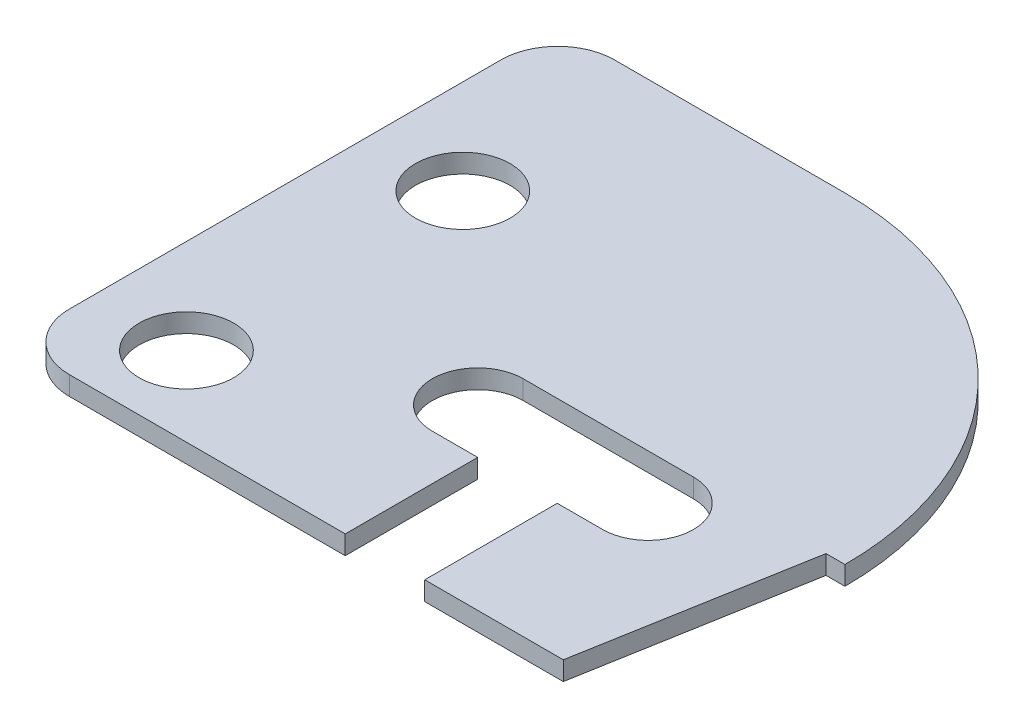
ISO-10303-21;
HEADER;
FILE_DESCRIPTION(('STEP AP214'),'2;1');
FILE_NAME('part.step','',(''),(''),'','','');
FILE_SCHEMA(('AUTOMOTIVE_DESIGN { 1 0 10303 214 1 1 1 1 }'));
ENDSEC;
DATA;
#1=APPLICATION_CONTEXT('core data for automotive mechanical design processes');
#2=APPLICATION_PROTOCOL_DEFINITION('international standard','automotive_design',2000,#1);
#3=PRODUCT_CONTEXT('',#1,'mechanical');
#4=PRODUCT('Part','Part','',(#3));
#5=PRODUCT_RELATED_PRODUCT_CATEGORY('part','',(#4));
#6=PRODUCT_DEFINITION_FORMATION('','',#4);
#7=PRODUCT_DEFINITION_CONTEXT('part definition',#1,'design');
#8=PRODUCT_DEFINITION('design','',#6,#7);
#9=PRODUCT_DEFINITION_SHAPE('','',#8);
#10=(LENGTH_UNIT() NAMED_UNIT(*) SI_UNIT(.MILLI.,.METRE.));
#11=(NAMED_UNIT(*) PLANE_ANGLE_UNIT() SI_UNIT($,.RADIAN.));
#12=(NAMED_UNIT(*) SI_UNIT($,.STERADIAN.) SOLID_ANGLE_UNIT());
#13=UNCERTAINTY_MEASURE_WITH_UNIT(LENGTH_MEASURE(1.E-05),#10,'distance_accuracy_value','');
#14=(GEOMETRIC_REPRESENTATION_CONTEXT(3) GLOBAL_UNCERTAINTY_ASSIGNED_CONTEXT((#13)) GLOBAL_UNIT_ASSIGNED_CONTEXT((#10,
#11,#12)) REPRESENTATION_CONTEXT('',''));
#15=CARTESIAN_POINT('',(0.,0.,0.));
#16=DIRECTION('',(0.,0.,1.));
#17=DIRECTION('',(1.,0.,0.));
#18=AXIS2_PLACEMENT_3D('',#15,#16,#17);
#19=CARTESIAN_POINT('',(-30.87318549428,0.,-85.));
#20=DIRECTION('',(0.,0.,-1.));
#21=DIRECTION('',(0.984807753012209,0.173648177666927,0.));
#22=AXIS2_PLACEMENT_3D('',#19,#20,#21);
#23=PLANE('',#22);
#24=DIRECTION('',(1.,0.,0.));
#25=VECTOR('',#24,1.);
#26=CARTESIAN_POINT('',(-30.87318549428,0.,-85.));
#27=LINE('',#26,#25);
#28=CARTESIAN_POINT('',(-60.87318549428,1.73472347597681E-13,-85.));
#29=VERTEX_POINT('',#28);
#30=CARTESIAN_POINT('',(0.,0.,-85.));
#31=VERTEX_POINT('',#30);
#32=EDGE_CURVE('E275',#29,#31,#27,.T.);
#33=ORIENTED_EDGE('',*,*,#32,.T.);
#34=DIRECTION('',(0.,1.,0.));
#35=VECTOR('',#34,1.);
#36=CARTESIAN_POINT('',(0.,-5.,-85.));
#37=LINE('',#36,#35);
#38=CARTESIAN_POINT('',(0.,-5.,-85.));
#39=VERTEX_POINT('',#38);
#40=EDGE_CURVE('E228',#39,#31,#37,.T.);
#41=ORIENTED_EDGE('',*,*,#40,.F.);
#42=DIRECTION('',(-1.,0.,0.));
#43=VECTOR('',#42,1.);
#44=CARTESIAN_POINT('',(-60.87318549428,-4.99999999999983,-85.));
#45=LINE('',#44,#43);
#46=CARTESIAN_POINT('',(-60.87318549428,-4.99999999999983,-85.));
#47=VERTEX_POINT('',#46);
#48=EDGE_CURVE('E285',#47,#39,#45,.F.);
#49=ORIENTED_EDGE('',*,*,#48,.F.);
#50=DIRECTION('',(0.,-1.,0.));
#51=VECTOR('',#50,1.);
#52=CARTESIAN_POINT('',(-60.87318549428,1.73472347597681E-13,-85.));
#53=LINE('',#52,#51);
#54=EDGE_CURVE('E13',#29,#47,#53,.T.);
#55=ORIENTED_EDGE('',*,*,#54,.F.);
#56=EDGE_LOOP('',(#33,#41,#49,#55));
#57=FACE_BOUND('',#56,.T.);
#58=ADVANCED_FACE('F67',(#57),#23,.T.);
#59=CARTESIAN_POINT('',(-60.8731854942799,1.73472347597681E-13,59.));
#60=DIRECTION('',(0.,0.,1.));
#61=DIRECTION('',(0.173648177666927,-0.984807753012209,0.));
#62=AXIS2_PLACEMENT_3D('',#59,#60,#61);
#63=PLANE('',#62);
#64=DIRECTION('',(1.,0.,0.));
#65=VECTOR('',#64,1.);
#66=CARTESIAN_POINT('',(-60.87318549428,-4.99999999999983,59.));
#67=LINE('',#66,#65);
#68=CARTESIAN_POINT('',(12.,-5.,59.));
#69=VERTEX_POINT('',#68);
#70=CARTESIAN_POINT('',(-60.87318549428,-4.99999999999983,59.));
#71=VERTEX_POINT('',#70);
#72=EDGE_CURVE('E115',#69,#71,#67,.F.);
#73=ORIENTED_EDGE('',*,*,#72,.F.);
#74=DIRECTION('',(0.,1.,0.));
#75=VECTOR('',#74,1.);
#76=CARTESIAN_POINT('',(12.,-5.,59.));
#77=LINE('',#76,#75);
#78=CARTESIAN_POINT('',(12.,0.,59.));
#79=VERTEX_POINT('',#78);
#80=EDGE_CURVE('E266',#69,#79,#77,.T.);
#81=ORIENTED_EDGE('',*,*,#80,.T.);
#82=DIRECTION('',(-1.,0.,0.));
#83=VECTOR('',#82,1.);
#84=CARTESIAN_POINT('',(-60.8731854942799,1.73472347597681E-13,59.));
#85=LINE('',#84,#83);
#86=CARTESIAN_POINT('',(-60.8731854942799,1.73472347597681E-13,59.));
#87=VERTEX_POINT('',#86);
#88=EDGE_CURVE('E123',#79,#87,#85,.T.);
#89=ORIENTED_EDGE('',*,*,#88,.T.);
#90=DIRECTION('',(0.,-1.,0.));
#91=VECTOR('',#90,1.);
#92=CARTESIAN_POINT('',(-60.8731854942799,1.59594559789866E-13,59.));
#93=LINE('',#92,#91);
#94=EDGE_CURVE('E273',#87,#71,#93,.T.);
#95=ORIENTED_EDGE('',*,*,#94,.T.);
#96=EDGE_LOOP('',(#73,#81,#89,#95));
#97=FACE_BOUND('',#96,.T.);
#98=ADVANCED_FACE('F315',(#97),#63,.T.);
#99=CARTESIAN_POINT('',(0.,0.,12.));
#100=DIRECTION('',(0.,1.,0.));
#101=DIRECTION('',(0.,0.,1.));
#102=AXIS2_PLACEMENT_3D('',#99,#100,#101);
#103=PLANE('',#102);
#104=CARTESIAN_POINT('',(-50.9494325752403,1.11022302462516E-13,-35.));
#105=DIRECTION('',(0.,1.,0.));
#106=DIRECTION('',(-1.,0.,0.));
#107=AXIS2_PLACEMENT_3D('',#104,#105,#106);
#108=CIRCLE('',#107,12.5);
#109=CARTESIAN_POINT('',(-63.4494325752403,1.98105420956551E-13,-35.));
#110=VERTEX_POINT('',#109);
#111=EDGE_CURVE('E263',#110,#110,#108,.T.);
#112=ORIENTED_EDGE('',*,*,#111,.F.);
#113=EDGE_LOOP('',(#112));
#114=FACE_BOUND('',#113,.T.);
#115=CARTESIAN_POINT('',(-50.9494325752403,1.11022302462516E-13,38.));
#116=DIRECTION('',(0.,1.,0.));
#117=DIRECTION('',(-1.,0.,0.));
#118=AXIS2_PLACEMENT_3D('',#115,#116,#117);
#119=CIRCLE('',#118,12.5);
#120=CARTESIAN_POINT('',(-63.4494325752403,1.98105420956551E-13,38.));
#121=VERTEX_POINT('',#120);
#122=EDGE_CURVE('E267',#121,#121,#119,.T.);
#123=ORIENTED_EDGE('',*,*,#122,.F.);
#124=EDGE_LOOP('',(#123));
#125=FACE_BOUND('',#124,.T.);
#126=ORIENTED_EDGE('',*,*,#88,.F.);
#127=DIRECTION('',(0.,0.,-1.));
#128=VECTOR('',#127,1.);
#129=CARTESIAN_POINT('',(12.,0.,24.));
#130=LINE('',#129,#128);
#131=CARTESIAN_POINT('',(12.,0.,24.));
#132=VERTEX_POINT('',#131);
#133=EDGE_CURVE('E385',#79,#132,#130,.T.);
#134=ORIENTED_EDGE('',*,*,#133,.T.);
#135=DIRECTION('',(-1.,0.,0.));
#136=VECTOR('',#135,1.);
#137=CARTESIAN_POINT('',(0.,0.,24.));
#138=LINE('',#137,#136);
#139=CARTESIAN_POINT('',(0.,0.,24.));
#140=VERTEX_POINT('',#139);
#141=EDGE_CURVE('E387',#132,#140,#138,.T.);
#142=ORIENTED_EDGE('',*,*,#141,.T.);
#143=CARTESIAN_POINT('',(0.,0.,12.));
#144=DIRECTION('',(0.,-1.,0.));
#145=DIRECTION('',(0.,0.,1.));
#146=AXIS2_PLACEMENT_3D('',#143,#144,#145);
#147=CIRCLE('',#146,12.);
#148=CARTESIAN_POINT('',(0.,0.,0.));
#149=VERTEX_POINT('',#148);
#150=EDGE_CURVE('E203',#140,#149,#147,.T.);
#151=ORIENTED_EDGE('',*,*,#150,.T.);
#152=DIRECTION('',(1.,0.,0.));
#153=VECTOR('',#152,1.);
#154=CARTESIAN_POINT('',(0.,0.,0.));
#155=LINE('',#154,#153);
#156=CARTESIAN_POINT('',(45.,0.,0.));
#157=VERTEX_POINT('',#156);
#158=EDGE_CURVE('E198',#149,#157,#155,.T.);
#159=ORIENTED_EDGE('',*,*,#158,.T.);
#160=CARTESIAN_POINT('',(45.,0.,12.));
#161=DIRECTION('',(0.,-1.,0.));
#162=DIRECTION('',(0.,0.,1.));
#163=AXIS2_PLACEMENT_3D('',#160,#161,#162);
#164=CIRCLE('',#163,12.);
#165=CARTESIAN_POINT('',(45.,0.,24.));
#166=VERTEX_POINT('',#165);
#167=EDGE_CURVE('E373',#157,#166,#164,.T.);
#168=ORIENTED_EDGE('',*,*,#167,.T.);
#169=DIRECTION('',(-1.,0.,0.));
#170=VECTOR('',#169,1.);
#171=CARTESIAN_POINT('',(33.,0.,24.));
#172=LINE('',#171,#170);
#173=CARTESIAN_POINT('',(33.,0.,24.));
#174=VERTEX_POINT('',#173);
#175=EDGE_CURVE('E369',#166,#174,#172,.T.);
#176=ORIENTED_EDGE('',*,*,#175,.T.);
#177=DIRECTION('',(0.,0.,1.));
#178=VECTOR('',#177,1.);
#179=CARTESIAN_POINT('',(33.,0.,24.));
#180=LINE('',#179,#178);
#181=CARTESIAN_POINT('',(33.,0.,59.));
#182=VERTEX_POINT('',#181);
#183=EDGE_CURVE('E364',#174,#182,#180,.T.);
#184=ORIENTED_EDGE('',*,*,#183,.T.);
#185=DIRECTION('',(1.,0.,0.));
#186=VECTOR('',#185,1.);
#187=CARTESIAN_POINT('',(33.,0.,59.));
#188=LINE('',#187,#186);
#189=CARTESIAN_POINT('',(69.5967081382004,0.,59.));
#190=VERTEX_POINT('',#189);
#191=EDGE_CURVE('E359',#182,#190,#188,.T.);
#192=ORIENTED_EDGE('',*,*,#191,.T.);
#193=DIRECTION('',(0.173648177666934,0.,-0.984807753012208));
#194=VECTOR('',#193,1.);
#195=CARTESIAN_POINT('',(80.,0.,0.));
#196=LINE('',#195,#194);
#197=CARTESIAN_POINT('',(80.,0.,0.));
#198=VERTEX_POINT('',#197);
#199=EDGE_CURVE('E352',#190,#198,#196,.T.);
#200=ORIENTED_EDGE('',*,*,#199,.T.);
#201=DIRECTION('',(1.,0.,0.));
#202=VECTOR('',#201,1.);
#203=CARTESIAN_POINT('',(85.,0.,0.));
#204=LINE('',#203,#202);
#205=CARTESIAN_POINT('',(85.,0.,0.));
#206=VERTEX_POINT('',#205);
#207=EDGE_CURVE('E347',#198,#206,#204,.T.);
#208=ORIENTED_EDGE('',*,*,#207,.T.);
#209=CARTESIAN_POINT('',(0.,0.,0.));
#210=DIRECTION('',(0.,1.,0.));
#211=DIRECTION('',(0.,0.,-1.));
#212=AXIS2_PLACEMENT_3D('',#209,#210,#211);
#213=CIRCLE('',#212,85.);
#214=EDGE_CURVE('E383',#206,#31,#213,.T.);
#215=ORIENTED_EDGE('',*,*,#214,.T.);
#216=ORIENTED_EDGE('',*,*,#32,.F.);
#217=CARTESIAN_POINT('',(-60.87318549428,1.73472347597681E-13,-70.));
#218=DIRECTION('',(0.,1.,0.));
#219=DIRECTION('',(-1.,0.,0.));
#220=AXIS2_PLACEMENT_3D('',#217,#218,#219);
#221=CIRCLE('',#220,15.);
#222=CARTESIAN_POINT('',(-75.87318549428,2.77555756156289E-13,-70.));
#223=VERTEX_POINT('',#222);
#224=EDGE_CURVE('E277',#223,#29,#221,.F.);
#225=ORIENTED_EDGE('',*,*,#224,.F.);
#226=DIRECTION('',(0.,0.,-1.));
#227=VECTOR('',#226,1.);
#228=CARTESIAN_POINT('',(-75.87318549428,2.77555756156289E-13,-70.));
#229=LINE('',#228,#227);
#230=CARTESIAN_POINT('',(-75.87318549428,2.77555756156289E-13,44.));
#231=VERTEX_POINT('',#230);
#232=EDGE_CURVE('E279',#231,#223,#229,.T.);
#233=ORIENTED_EDGE('',*,*,#232,.F.);
#234=CARTESIAN_POINT('',(-60.8731854942799,1.73472347597681E-13,44.));
#235=DIRECTION('',(0.,1.,0.));
#236=DIRECTION('',(-1.,0.,0.));
#237=AXIS2_PLACEMENT_3D('',#234,#235,#236);
#238=CIRCLE('',#237,15.);
#239=EDGE_CURVE('E282',#87,#231,#238,.F.);
#240=ORIENTED_EDGE('',*,*,#239,.F.);
#241=EDGE_LOOP('',(#126,#134,#142,#151,#159,#168,#176,#184,#192,#200,#208,#215,#216,#225,#233,#240));
#242=FACE_BOUND('',#241,.T.);
#243=ADVANCED_FACE('F69',(#114,#125,#242),#103,.T.);
#244=CARTESIAN_POINT('',(-60.87318549428,-4.99999999999983,-70.));
#245=DIRECTION('',(0.,1.,0.));
#246=DIRECTION('',(-1.,0.,0.));
#247=AXIS2_PLACEMENT_3D('',#244,#245,#246);
#248=PLANE('',#247);
#249=CARTESIAN_POINT('',(-50.9494325752404,-4.99999999999991,-35.));
#250=DIRECTION('',(0.,1.,0.));
#251=DIRECTION('',(-1.,0.,0.));
#252=AXIS2_PLACEMENT_3D('',#249,#250,#251);
#253=CIRCLE('',#252,12.5);
#254=CARTESIAN_POINT('',(-63.4494325752404,-4.99999999999983,-35.));
#255=VERTEX_POINT('',#254);
#256=EDGE_CURVE('E71',#255,#255,#253,.T.);
#257=ORIENTED_EDGE('',*,*,#256,.T.);
#258=EDGE_LOOP('',(#257));
#259=FACE_BOUND('',#258,.T.);
#260=CARTESIAN_POINT('',(-50.9494325752403,-4.99999999999993,38.));
#261=DIRECTION('',(0.,1.,0.));
#262=DIRECTION('',(-1.,0.,0.));
#263=AXIS2_PLACEMENT_3D('',#260,#261,#262);
#264=CIRCLE('',#263,12.5);
#265=CARTESIAN_POINT('',(-63.4494325752403,-4.99999999999984,38.));
#266=VERTEX_POINT('',#265);
#267=EDGE_CURVE('E269',#266,#266,#264,.T.);
#268=ORIENTED_EDGE('',*,*,#267,.T.);
#269=EDGE_LOOP('',(#268));
#270=FACE_BOUND('',#269,.T.);
#271=ORIENTED_EDGE('',*,*,#48,.T.);
#272=CARTESIAN_POINT('',(0.,-5.,0.));
#273=DIRECTION('',(0.,1.,0.));
#274=DIRECTION('',(0.,0.,-1.));
#275=AXIS2_PLACEMENT_3D('',#272,#273,#274);
#276=CIRCLE('',#275,85.);
#277=CARTESIAN_POINT('',(85.,-5.,0.));
#278=VERTEX_POINT('',#277);
#279=EDGE_CURVE('E231',#278,#39,#276,.T.);
#280=ORIENTED_EDGE('',*,*,#279,.F.);
#281=DIRECTION('',(1.,0.,0.));
#282=VECTOR('',#281,1.);
#283=CARTESIAN_POINT('',(85.,-5.,0.));
#284=LINE('',#283,#282);
#285=CARTESIAN_POINT('',(80.,-5.,0.));
#286=VERTEX_POINT('',#285);
#287=EDGE_CURVE('E236',#286,#278,#284,.T.);
#288=ORIENTED_EDGE('',*,*,#287,.F.);
#289=DIRECTION('',(0.173648177666934,0.,-0.984807753012208));
#290=VECTOR('',#289,1.);
#291=CARTESIAN_POINT('',(80.,-5.,0.));
#292=LINE('',#291,#290);
#293=CARTESIAN_POINT('',(69.5967081382004,-5.,59.));
#294=VERTEX_POINT('',#293);
#295=EDGE_CURVE('E241',#294,#286,#292,.T.);
#296=ORIENTED_EDGE('',*,*,#295,.F.);
#297=DIRECTION('',(1.,0.,0.));
#298=VECTOR('',#297,1.);
#299=CARTESIAN_POINT('',(33.,-5.,59.));
#300=LINE('',#299,#298);
#301=CARTESIAN_POINT('',(33.,-5.,59.));
#302=VERTEX_POINT('',#301);
#303=EDGE_CURVE('E246',#302,#294,#300,.T.);
#304=ORIENTED_EDGE('',*,*,#303,.F.);
#305=DIRECTION('',(0.,0.,1.));
#306=VECTOR('',#305,1.);
#307=CARTESIAN_POINT('',(33.,-5.,24.));
#308=LINE('',#307,#306);
#309=CARTESIAN_POINT('',(33.,-5.,24.));
#310=VERTEX_POINT('',#309);
#311=EDGE_CURVE('E251',#310,#302,#308,.T.);
#312=ORIENTED_EDGE('',*,*,#311,.F.);
#313=DIRECTION('',(-1.,0.,0.));
#314=VECTOR('',#313,1.);
#315=CARTESIAN_POINT('',(33.,-5.,24.));
#316=LINE('',#315,#314);
#317=CARTESIAN_POINT('',(45.,-5.,24.));
#318=VERTEX_POINT('',#317);
#319=EDGE_CURVE('E256',#318,#310,#316,.T.);
#320=ORIENTED_EDGE('',*,*,#319,.F.);
#321=CARTESIAN_POINT('',(45.,-5.,12.));
#322=DIRECTION('',(0.,-1.,0.));
#323=DIRECTION('',(0.,0.,1.));
#324=AXIS2_PLACEMENT_3D('',#321,#322,#323);
#325=CIRCLE('',#324,12.);
#326=CARTESIAN_POINT('',(45.,-5.,0.));
#327=VERTEX_POINT('',#326);
#328=EDGE_CURVE('E213',#327,#318,#325,.T.);
#329=ORIENTED_EDGE('',*,*,#328,.F.);
#330=DIRECTION('',(1.,0.,0.));
#331=VECTOR('',#330,1.);
#332=CARTESIAN_POINT('',(0.,-5.,0.));
#333=LINE('',#332,#331);
#334=CARTESIAN_POINT('',(0.,-5.,0.));
#335=VERTEX_POINT('',#334);
#336=EDGE_CURVE('E196',#335,#327,#333,.T.);
#337=ORIENTED_EDGE('',*,*,#336,.F.);
#338=CARTESIAN_POINT('',(0.,-5.,12.));
#339=DIRECTION('',(0.,-1.,0.));
#340=DIRECTION('',(0.,0.,1.));
#341=AXIS2_PLACEMENT_3D('',#338,#339,#340);
#342=CIRCLE('',#341,12.);
#343=CARTESIAN_POINT('',(0.,-5.,24.));
#344=VERTEX_POINT('',#343);
#345=EDGE_CURVE('E204',#344,#335,#342,.T.);
#346=ORIENTED_EDGE('',*,*,#345,.F.);
#347=DIRECTION('',(-1.,0.,0.));
#348=VECTOR('',#347,1.);
#349=CARTESIAN_POINT('',(0.,-5.,24.));
#350=LINE('',#349,#348);
#351=CARTESIAN_POINT('',(12.,-5.,24.));
#352=VERTEX_POINT('',#351);
#353=EDGE_CURVE('E218',#352,#344,#350,.T.);
#354=ORIENTED_EDGE('',*,*,#353,.F.);
#355=DIRECTION('',(0.,0.,-1.));
#356=VECTOR('',#355,1.);
#357=CARTESIAN_POINT('',(12.,-5.,24.));
#358=LINE('',#357,#356);
#359=EDGE_CURVE('E225',#69,#352,#358,.T.);
#360=ORIENTED_EDGE('',*,*,#359,.F.);
#361=ORIENTED_EDGE('',*,*,#72,.T.);
#362=CARTESIAN_POINT('',(-60.87318549428,-4.99999999999983,44.));
#363=DIRECTION('',(0.,1.,0.));
#364=DIRECTION('',(-1.,0.,0.));
#365=AXIS2_PLACEMENT_3D('',#362,#363,#364);
#366=CIRCLE('',#365,15.);
#367=CARTESIAN_POINT('',(-75.87318549428,-4.99999999999973,44.));
#368=VERTEX_POINT('',#367);
#369=EDGE_CURVE('E293',#71,#368,#366,.F.);
#370=ORIENTED_EDGE('',*,*,#369,.T.);
#371=DIRECTION('',(0.,0.,1.));
#372=VECTOR('',#371,1.);
#373=CARTESIAN_POINT('',(-75.87318549428,-4.99999999999973,-70.));
#374=LINE('',#373,#372);
#375=CARTESIAN_POINT('',(-75.87318549428,-4.99999999999973,-70.));
#376=VERTEX_POINT('',#375);
#377=EDGE_CURVE('E290',#368,#376,#374,.F.);
#378=ORIENTED_EDGE('',*,*,#377,.T.);
#379=CARTESIAN_POINT('',(-60.87318549428,-4.99999999999983,-70.));
#380=DIRECTION('',(0.,1.,0.));
#381=DIRECTION('',(-1.,0.,0.));
#382=AXIS2_PLACEMENT_3D('',#379,#380,#381);
#383=CIRCLE('',#382,15.);
#384=EDGE_CURVE('E287',#376,#47,#383,.F.);
#385=ORIENTED_EDGE('',*,*,#384,.T.);
#386=EDGE_LOOP('',(#271,#280,#288,#296,#304,#312,#320,#329,#337,#346,#354,#360,#361,#370,#378,#385));
#387=FACE_BOUND('',#386,.T.);
#388=ADVANCED_FACE('F208',(#259,#270,#387),#248,.F.);
#389=CARTESIAN_POINT('',(-60.87318549428,1.73472347597681E-13,-70.));
#390=DIRECTION('',(0.,-1.,0.));
#391=DIRECTION('',(1.,0.,0.));
#392=AXIS2_PLACEMENT_3D('',#389,#390,#391);
#393=CYLINDRICAL_SURFACE('',#392,15.);
#394=ORIENTED_EDGE('',*,*,#384,.F.);
#395=DIRECTION('',(0.,-1.,0.));
#396=VECTOR('',#395,1.);
#397=CARTESIAN_POINT('',(-75.87318549428,2.63677968348475E-13,-70.));
#398=LINE('',#397,#396);
#399=EDGE_CURVE('E77',#223,#376,#398,.T.);
#400=ORIENTED_EDGE('',*,*,#399,.F.);
#401=ORIENTED_EDGE('',*,*,#224,.T.);
#402=ORIENTED_EDGE('',*,*,#54,.T.);
#403=EDGE_LOOP('',(#394,#400,#401,#402));
#404=FACE_BOUND('',#403,.T.);
#405=ADVANCED_FACE('F322',(#404),#393,.T.);
#406=CARTESIAN_POINT('',(-75.87318549428,2.63677968348475E-13,-70.));
#407=DIRECTION('',(-1.,0.,0.));
#408=DIRECTION('',(0.,-1.,0.));
#409=AXIS2_PLACEMENT_3D('',#406,#407,#408);
#410=PLANE('',#409);
#411=ORIENTED_EDGE('',*,*,#377,.F.);
#412=DIRECTION('',(0.,-1.,0.));
#413=VECTOR('',#412,1.);
#414=CARTESIAN_POINT('',(-75.8731854942799,2.63677968348475E-13,44.));
#415=LINE('',#414,#413);
#416=EDGE_CURVE('E107',#231,#368,#415,.T.);
#417=ORIENTED_EDGE('',*,*,#416,.F.);
#418=ORIENTED_EDGE('',*,*,#232,.T.);
#419=ORIENTED_EDGE('',*,*,#399,.T.);
#420=EDGE_LOOP('',(#411,#417,#418,#419));
#421=FACE_BOUND('',#420,.T.);
#422=ADVANCED_FACE('F311',(#421),#410,.T.);
#423=CARTESIAN_POINT('',(-60.8731854942799,1.73472347597681E-13,44.));
#424=DIRECTION('',(0.,-1.,0.));
#425=DIRECTION('',(1.,0.,0.));
#426=AXIS2_PLACEMENT_3D('',#423,#424,#425);
#427=CYLINDRICAL_SURFACE('',#426,15.);
#428=ORIENTED_EDGE('',*,*,#369,.F.);
#429=ORIENTED_EDGE('',*,*,#94,.F.);
#430=ORIENTED_EDGE('',*,*,#239,.T.);
#431=ORIENTED_EDGE('',*,*,#416,.T.);
#432=EDGE_LOOP('',(#428,#429,#430,#431));
#433=FACE_BOUND('',#432,.T.);
#434=ADVANCED_FACE('F302',(#433),#427,.T.);
#435=CARTESIAN_POINT('',(-50.9494325752412,-124.758900215609,38.));
#436=DIRECTION('',(0.,1.,0.));
#437=DIRECTION('',(-1.,0.,0.));
#438=AXIS2_PLACEMENT_3D('',#435,#436,#437);
#439=CYLINDRICAL_SURFACE('',#438,12.5);
#440=ORIENTED_EDGE('',*,*,#122,.T.);
#441=EDGE_LOOP('',(#440));
#442=FACE_BOUND('',#441,.T.);
#443=ORIENTED_EDGE('',*,*,#267,.F.);
#444=EDGE_LOOP('',(#443));
#445=FACE_BOUND('',#444,.T.);
#446=ADVANCED_FACE('F299',(#442,#445),#439,.F.);
#447=CARTESIAN_POINT('',(-50.9494325752412,-124.758900215609,-35.));
#448=DIRECTION('',(0.,1.,0.));
#449=DIRECTION('',(-1.,0.,0.));
#450=AXIS2_PLACEMENT_3D('',#447,#448,#449);
#451=CYLINDRICAL_SURFACE('',#450,12.5);
#452=ORIENTED_EDGE('',*,*,#111,.T.);
#453=EDGE_LOOP('',(#452));
#454=FACE_BOUND('',#453,.T.);
#455=ORIENTED_EDGE('',*,*,#256,.F.);
#456=EDGE_LOOP('',(#455));
#457=FACE_BOUND('',#456,.T.);
#458=ADVANCED_FACE('F301',(#454,#457),#451,.F.);
#459=CARTESIAN_POINT('',(0.,-5.,0.));
#460=DIRECTION('',(0.,0.,1.));
#461=DIRECTION('',(1.,0.,0.));
#462=AXIS2_PLACEMENT_3D('',#459,#460,#461);
#463=PLANE('',#462);
#464=ORIENTED_EDGE('',*,*,#158,.F.);
#465=DIRECTION('',(0.,1.,0.));
#466=VECTOR('',#465,1.);
#467=CARTESIAN_POINT('',(0.,-5.,0.));
#468=LINE('',#467,#466);
#469=EDGE_CURVE('E193',#335,#149,#468,.T.);
#470=ORIENTED_EDGE('',*,*,#469,.F.);
#471=ORIENTED_EDGE('',*,*,#336,.T.);
#472=DIRECTION('',(0.,1.,0.));
#473=VECTOR('',#472,1.);
#474=CARTESIAN_POINT('',(45.,-5.,0.));
#475=LINE('',#474,#473);
#476=EDGE_CURVE('E190',#327,#157,#475,.T.);
#477=ORIENTED_EDGE('',*,*,#476,.T.);
#478=EDGE_LOOP('',(#464,#470,#471,#477));
#479=FACE_BOUND('',#478,.T.);
#480=ADVANCED_FACE('F195',(#479),#463,.T.);
#481=CARTESIAN_POINT('',(45.,-5.,12.));
#482=DIRECTION('',(0.,1.,0.));
#483=DIRECTION('',(0.,0.,1.));
#484=AXIS2_PLACEMENT_3D('',#481,#482,#483);
#485=CYLINDRICAL_SURFACE('',#484,12.);
#486=ORIENTED_EDGE('',*,*,#167,.F.);
#487=ORIENTED_EDGE('',*,*,#476,.F.);
#488=ORIENTED_EDGE('',*,*,#328,.T.);
#489=DIRECTION('',(0.,1.,0.));
#490=VECTOR('',#489,1.);
#491=CARTESIAN_POINT('',(45.,-5.,24.));
#492=LINE('',#491,#490);
#493=EDGE_CURVE('E259',#318,#166,#492,.T.);
#494=ORIENTED_EDGE('',*,*,#493,.T.);
#495=EDGE_LOOP('',(#486,#487,#488,#494));
#496=FACE_BOUND('',#495,.T.);
#497=ADVANCED_FACE('F372',(#496),#485,.F.);
#498=CARTESIAN_POINT('',(33.,-5.,24.));
#499=DIRECTION('',(0.,0.,-1.));
#500=DIRECTION('',(-1.,0.,0.));
#501=AXIS2_PLACEMENT_3D('',#498,#499,#500);
#502=PLANE('',#501);
#503=ORIENTED_EDGE('',*,*,#175,.F.);
#504=ORIENTED_EDGE('',*,*,#493,.F.);
#505=ORIENTED_EDGE('',*,*,#319,.T.);
#506=DIRECTION('',(0.,1.,0.));
#507=VECTOR('',#506,1.);
#508=CARTESIAN_POINT('',(33.,-5.,24.));
#509=LINE('',#508,#507);
#510=EDGE_CURVE('E254',#310,#174,#509,.T.);
#511=ORIENTED_EDGE('',*,*,#510,.T.);
#512=EDGE_LOOP('',(#503,#504,#505,#511));
#513=FACE_BOUND('',#512,.T.);
#514=ADVANCED_FACE('F368',(#513),#502,.T.);
#515=CARTESIAN_POINT('',(33.,-5.,24.));
#516=DIRECTION('',(-1.,0.,0.));
#517=DIRECTION('',(0.,0.,1.));
#518=AXIS2_PLACEMENT_3D('',#515,#516,#517);
#519=PLANE('',#518);
#520=ORIENTED_EDGE('',*,*,#183,.F.);
#521=ORIENTED_EDGE('',*,*,#510,.F.);
#522=ORIENTED_EDGE('',*,*,#311,.T.);
#523=DIRECTION('',(0.,1.,0.));
#524=VECTOR('',#523,1.);
#525=CARTESIAN_POINT('',(33.,-5.,59.));
#526=LINE('',#525,#524);
#527=EDGE_CURVE('E249',#302,#182,#526,.T.);
#528=ORIENTED_EDGE('',*,*,#527,.T.);
#529=EDGE_LOOP('',(#520,#521,#522,#528));
#530=FACE_BOUND('',#529,.T.);
#531=ADVANCED_FACE('F363',(#530),#519,.T.);
#532=CARTESIAN_POINT('',(33.,-5.,59.));
#533=DIRECTION('',(0.,0.,1.));
#534=DIRECTION('',(1.,0.,0.));
#535=AXIS2_PLACEMENT_3D('',#532,#533,#534);
#536=PLANE('',#535);
#537=ORIENTED_EDGE('',*,*,#191,.F.);
#538=ORIENTED_EDGE('',*,*,#527,.F.);
#539=ORIENTED_EDGE('',*,*,#303,.T.);
#540=DIRECTION('',(0.,1.,0.));
#541=VECTOR('',#540,1.);
#542=CARTESIAN_POINT('',(69.5967081382004,-5.,59.));
#543=LINE('',#542,#541);
#544=EDGE_CURVE('E244',#294,#190,#543,.T.);
#545=ORIENTED_EDGE('',*,*,#544,.T.);
#546=EDGE_LOOP('',(#537,#538,#539,#545));
#547=FACE_BOUND('',#546,.T.);
#548=ADVANCED_FACE('F358',(#547),#536,.T.);
#549=CARTESIAN_POINT('',(80.,-5.,0.));
#550=DIRECTION('',(0.984807753012208,0.,0.173648177666934));
#551=DIRECTION('',(0.173648177666934,0.,-0.984807753012208));
#552=AXIS2_PLACEMENT_3D('',#549,#550,#551);
#553=PLANE('',#552);
#554=ORIENTED_EDGE('',*,*,#199,.F.);
#555=ORIENTED_EDGE('',*,*,#544,.F.);
#556=ORIENTED_EDGE('',*,*,#295,.T.);
#557=DIRECTION('',(0.,1.,0.));
#558=VECTOR('',#557,1.);
#559=CARTESIAN_POINT('',(80.,-5.,0.));
#560=LINE('',#559,#558);
#561=EDGE_CURVE('E239',#286,#198,#560,.T.);
#562=ORIENTED_EDGE('',*,*,#561,.T.);
#563=EDGE_LOOP('',(#554,#555,#556,#562));
#564=FACE_BOUND('',#563,.T.);
#565=ADVANCED_FACE('F351',(#564),#553,.T.);
#566=CARTESIAN_POINT('',(85.,-5.,0.));
#567=DIRECTION('',(0.,0.,1.));
#568=DIRECTION('',(1.,0.,0.));
#569=AXIS2_PLACEMENT_3D('',#566,#567,#568);
#570=PLANE('',#569);
#571=ORIENTED_EDGE('',*,*,#207,.F.);
#572=ORIENTED_EDGE('',*,*,#561,.F.);
#573=ORIENTED_EDGE('',*,*,#287,.T.);
#574=DIRECTION('',(0.,1.,0.));
#575=VECTOR('',#574,1.);
#576=CARTESIAN_POINT('',(85.,-5.,0.));
#577=LINE('',#576,#575);
#578=EDGE_CURVE('E234',#278,#206,#577,.T.);
#579=ORIENTED_EDGE('',*,*,#578,.T.);
#580=EDGE_LOOP('',(#571,#572,#573,#579));
#581=FACE_BOUND('',#580,.T.);
#582=ADVANCED_FACE('F345',(#581),#570,.T.);
#583=CARTESIAN_POINT('',(0.,-5.,0.));
#584=DIRECTION('',(0.,1.,0.));
#585=DIRECTION('',(0.,0.,1.));
#586=AXIS2_PLACEMENT_3D('',#583,#584,#585);
#587=CYLINDRICAL_SURFACE('',#586,85.);
#588=ORIENTED_EDGE('',*,*,#214,.F.);
#589=ORIENTED_EDGE('',*,*,#578,.F.);
#590=ORIENTED_EDGE('',*,*,#279,.T.);
#591=ORIENTED_EDGE('',*,*,#40,.T.);
#592=EDGE_LOOP('',(#588,#589,#590,#591));
#593=FACE_BOUND('',#592,.T.);
#594=ADVANCED_FACE('F340',(#593),#587,.T.);
#595=CARTESIAN_POINT('',(12.,-5.,24.));
#596=DIRECTION('',(1.,0.,0.));
#597=DIRECTION('',(0.,0.,-1.));
#598=AXIS2_PLACEMENT_3D('',#595,#596,#597);
#599=PLANE('',#598);
#600=ORIENTED_EDGE('',*,*,#133,.F.);
#601=ORIENTED_EDGE('',*,*,#80,.F.);
#602=ORIENTED_EDGE('',*,*,#359,.T.);
#603=DIRECTION('',(0.,1.,0.));
#604=VECTOR('',#603,1.);
#605=CARTESIAN_POINT('',(12.,-5.,24.));
#606=LINE('',#605,#604);
#607=EDGE_CURVE('E223',#352,#132,#606,.T.);
#608=ORIENTED_EDGE('',*,*,#607,.T.);
#609=EDGE_LOOP('',(#600,#601,#602,#608));
#610=FACE_BOUND('',#609,.T.);
#611=ADVANCED_FACE('F392',(#610),#599,.T.);
#612=CARTESIAN_POINT('',(0.,-5.,24.));
#613=DIRECTION('',(0.,0.,-1.));
#614=DIRECTION('',(-1.,0.,0.));
#615=AXIS2_PLACEMENT_3D('',#612,#613,#614);
#616=PLANE('',#615);
#617=ORIENTED_EDGE('',*,*,#141,.F.);
#618=ORIENTED_EDGE('',*,*,#607,.F.);
#619=ORIENTED_EDGE('',*,*,#353,.T.);
#620=DIRECTION('',(0.,1.,0.));
#621=VECTOR('',#620,1.);
#622=CARTESIAN_POINT('',(0.,-5.,24.));
#623=LINE('',#622,#621);
#624=EDGE_CURVE('E216',#344,#140,#623,.T.);
#625=ORIENTED_EDGE('',*,*,#624,.T.);
#626=EDGE_LOOP('',(#617,#618,#619,#625));
#627=FACE_BOUND('',#626,.T.);
#628=ADVANCED_FACE('F395',(#627),#616,.T.);
#629=CARTESIAN_POINT('',(0.,-5.,12.));
#630=DIRECTION('',(0.,1.,0.));
#631=DIRECTION('',(0.,0.,1.));
#632=AXIS2_PLACEMENT_3D('',#629,#630,#631);
#633=CYLINDRICAL_SURFACE('',#632,12.);
#634=ORIENTED_EDGE('',*,*,#150,.F.);
#635=ORIENTED_EDGE('',*,*,#624,.F.);
#636=ORIENTED_EDGE('',*,*,#345,.T.);
#637=ORIENTED_EDGE('',*,*,#469,.T.);
#638=EDGE_LOOP('',(#634,#635,#636,#637));
#639=FACE_BOUND('',#638,.T.);
#640=ADVANCED_FACE('F215',(#639),#633,.F.);
#641=CLOSED_SHELL('',(#58,#98,#243,#388,#405,#422,#434,#446,#458,#480,#497,#514,#531,#548,#565,
#582,#594,#611,#628,#640));
#642=MANIFOLD_SOLID_BREP('B2',#641);
#643=ADVANCED_BREP_SHAPE_REPRESENTATION('',(#18,#642),#14);
#644=SHAPE_DEFINITION_REPRESENTATION(#9,#643);
ENDSEC;
END-ISO-10303-21;
